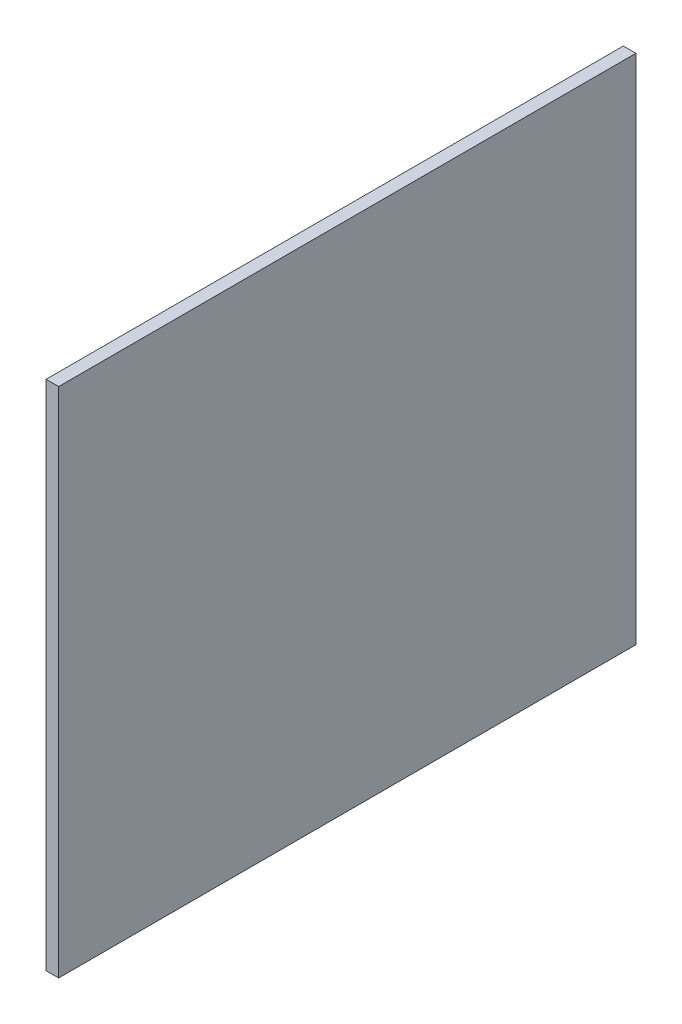
ISO-10303-21;
HEADER;
FILE_DESCRIPTION(('STEP AP214'),'2;1');
FILE_NAME('part.step','',(''),(''),'','','');
FILE_SCHEMA(('AUTOMOTIVE_DESIGN { 1 0 10303 214 1 1 1 1 }'));
ENDSEC;
DATA;
#1=APPLICATION_CONTEXT('core data for automotive mechanical design processes');
#2=APPLICATION_PROTOCOL_DEFINITION('international standard','automotive_design',2000,#1);
#3=PRODUCT_CONTEXT('',#1,'mechanical');
#4=PRODUCT('Part','Part','',(#3));
#5=PRODUCT_RELATED_PRODUCT_CATEGORY('part','',(#4));
#6=PRODUCT_DEFINITION_FORMATION('','',#4);
#7=PRODUCT_DEFINITION_CONTEXT('part definition',#1,'design');
#8=PRODUCT_DEFINITION('design','',#6,#7);
#9=PRODUCT_DEFINITION_SHAPE('','',#8);
#10=(LENGTH_UNIT() NAMED_UNIT(*) SI_UNIT(.MILLI.,.METRE.));
#11=(NAMED_UNIT(*) PLANE_ANGLE_UNIT() SI_UNIT($,.RADIAN.));
#12=(NAMED_UNIT(*) SI_UNIT($,.STERADIAN.) SOLID_ANGLE_UNIT());
#13=UNCERTAINTY_MEASURE_WITH_UNIT(LENGTH_MEASURE(1.E-05),#10,'distance_accuracy_value','');
#14=(GEOMETRIC_REPRESENTATION_CONTEXT(3) GLOBAL_UNCERTAINTY_ASSIGNED_CONTEXT((#13)) GLOBAL_UNIT_ASSIGNED_CONTEXT((#10,
#11,#12)) REPRESENTATION_CONTEXT('',''));
#15=CARTESIAN_POINT('',(0.,0.,0.));
#16=DIRECTION('',(0.,0.,1.));
#17=DIRECTION('',(1.,0.,0.));
#18=AXIS2_PLACEMENT_3D('',#15,#16,#17);
#19=CARTESIAN_POINT('',(-90.4615384615385,111.692307692308,550.));
#20=DIRECTION('',(1.,0.,0.));
#21=DIRECTION('',(0.,1.,0.));
#22=AXIS2_PLACEMENT_3D('',#19,#20,#21);
#23=PLANE('',#22);
#24=DIRECTION('',(0.,-1.,0.));
#25=VECTOR('',#24,1.);
#26=CARTESIAN_POINT('',(-90.4615384615385,111.692307692308,0.));
#27=LINE('',#26,#25);
#28=CARTESIAN_POINT('',(-90.4615384615385,111.692307692308,0.));
#29=VERTEX_POINT('',#28);
#30=CARTESIAN_POINT('',(-90.4615384615384,-376.307692307692,0.));
#31=VERTEX_POINT('',#30);
#32=EDGE_CURVE('E107',#29,#31,#27,.T.);
#33=ORIENTED_EDGE('',*,*,#32,.T.);
#34=DIRECTION('',(0.,0.,-1.));
#35=VECTOR('',#34,1.);
#36=CARTESIAN_POINT('',(-90.4615384615384,-376.307692307692,550.));
#37=LINE('',#36,#35);
#38=CARTESIAN_POINT('',(-90.4615384615384,-376.307692307692,550.));
#39=VERTEX_POINT('',#38);
#40=EDGE_CURVE('E11',#39,#31,#37,.T.);
#41=ORIENTED_EDGE('',*,*,#40,.F.);
#42=DIRECTION('',(0.,-1.,0.));
#43=VECTOR('',#42,1.);
#44=CARTESIAN_POINT('',(-90.4615384615385,111.692307692308,550.));
#45=LINE('',#44,#43);
#46=CARTESIAN_POINT('',(-90.4615384615385,111.692307692308,550.));
#47=VERTEX_POINT('',#46);
#48=EDGE_CURVE('E91',#47,#39,#45,.T.);
#49=ORIENTED_EDGE('',*,*,#48,.F.);
#50=DIRECTION('',(0.,0.,-1.));
#51=VECTOR('',#50,1.);
#52=CARTESIAN_POINT('',(-90.4615384615385,111.692307692308,550.));
#53=LINE('',#52,#51);
#54=EDGE_CURVE('E103',#47,#29,#53,.T.);
#55=ORIENTED_EDGE('',*,*,#54,.T.);
#56=EDGE_LOOP('',(#33,#41,#49,#55));
#57=FACE_BOUND('',#56,.T.);
#58=ADVANCED_FACE('F39',(#57),#23,.F.);
#59=CARTESIAN_POINT('',(-90.4615384615384,-376.307692307692,550.));
#60=DIRECTION('',(0.,1.,0.));
#61=DIRECTION('',(0.,0.,1.));
#62=AXIS2_PLACEMENT_3D('',#59,#60,#61);
#63=PLANE('',#62);
#64=DIRECTION('',(1.,0.,0.));
#65=VECTOR('',#64,1.);
#66=CARTESIAN_POINT('',(-90.4615384615384,-376.307692307692,0.));
#67=LINE('',#66,#65);
#68=CARTESIAN_POINT('',(-78.4615384615384,-376.307692307692,0.));
#69=VERTEX_POINT('',#68);
#70=EDGE_CURVE('E96',#31,#69,#67,.T.);
#71=ORIENTED_EDGE('',*,*,#70,.T.);
#72=DIRECTION('',(0.,0.,-1.));
#73=VECTOR('',#72,1.);
#74=CARTESIAN_POINT('',(-78.4615384615384,-376.307692307692,550.));
#75=LINE('',#74,#73);
#76=CARTESIAN_POINT('',(-78.4615384615384,-376.307692307692,550.));
#77=VERTEX_POINT('',#76);
#78=EDGE_CURVE('E48',#77,#69,#75,.T.);
#79=ORIENTED_EDGE('',*,*,#78,.F.);
#80=DIRECTION('',(1.,0.,0.));
#81=VECTOR('',#80,1.);
#82=CARTESIAN_POINT('',(-90.4615384615384,-376.307692307692,550.));
#83=LINE('',#82,#81);
#84=EDGE_CURVE('E86',#39,#77,#83,.T.);
#85=ORIENTED_EDGE('',*,*,#84,.F.);
#86=ORIENTED_EDGE('',*,*,#40,.T.);
#87=EDGE_LOOP('',(#71,#79,#85,#86));
#88=FACE_BOUND('',#87,.T.);
#89=ADVANCED_FACE('F95',(#88),#63,.F.);
#90=CARTESIAN_POINT('',(-78.4615384615385,111.692307692308,550.));
#91=DIRECTION('',(-1.,0.,0.));
#92=DIRECTION('',(0.,-1.,0.));
#93=AXIS2_PLACEMENT_3D('',#90,#91,#92);
#94=PLANE('',#93);
#95=DIRECTION('',(0.,1.,0.));
#96=VECTOR('',#95,1.);
#97=CARTESIAN_POINT('',(-78.4615384615385,111.692307692308,0.));
#98=LINE('',#97,#96);
#99=CARTESIAN_POINT('',(-78.4615384615385,111.692307692308,0.));
#100=VERTEX_POINT('',#99);
#101=EDGE_CURVE('E73',#69,#100,#98,.T.);
#102=ORIENTED_EDGE('',*,*,#101,.T.);
#103=DIRECTION('',(0.,0.,-1.));
#104=VECTOR('',#103,1.);
#105=CARTESIAN_POINT('',(-78.4615384615385,111.692307692308,550.));
#106=LINE('',#105,#104);
#107=CARTESIAN_POINT('',(-78.4615384615385,111.692307692308,550.));
#108=VERTEX_POINT('',#107);
#109=EDGE_CURVE('E98',#108,#100,#106,.T.);
#110=ORIENTED_EDGE('',*,*,#109,.F.);
#111=DIRECTION('',(0.,1.,0.));
#112=VECTOR('',#111,1.);
#113=CARTESIAN_POINT('',(-78.4615384615385,111.692307692308,550.));
#114=LINE('',#113,#112);
#115=EDGE_CURVE('E89',#77,#108,#114,.T.);
#116=ORIENTED_EDGE('',*,*,#115,.F.);
#117=ORIENTED_EDGE('',*,*,#78,.T.);
#118=EDGE_LOOP('',(#102,#110,#116,#117));
#119=FACE_BOUND('',#118,.T.);
#120=ADVANCED_FACE('F99',(#119),#94,.F.);
#121=CARTESIAN_POINT('',(-90.4615384615385,111.692307692308,550.));
#122=DIRECTION('',(0.,-1.,0.));
#123=DIRECTION('',(0.,0.,-1.));
#124=AXIS2_PLACEMENT_3D('',#121,#122,#123);
#125=PLANE('',#124);
#126=DIRECTION('',(-1.,0.,0.));
#127=VECTOR('',#126,1.);
#128=CARTESIAN_POINT('',(-90.4615384615385,111.692307692308,0.));
#129=LINE('',#128,#127);
#130=EDGE_CURVE('E79',#100,#29,#129,.T.);
#131=ORIENTED_EDGE('',*,*,#130,.T.);
#132=ORIENTED_EDGE('',*,*,#54,.F.);
#133=DIRECTION('',(-1.,0.,0.));
#134=VECTOR('',#133,1.);
#135=CARTESIAN_POINT('',(-90.4615384615385,111.692307692308,550.));
#136=LINE('',#135,#134);
#137=EDGE_CURVE('E56',#108,#47,#136,.T.);
#138=ORIENTED_EDGE('',*,*,#137,.F.);
#139=ORIENTED_EDGE('',*,*,#109,.T.);
#140=EDGE_LOOP('',(#131,#132,#138,#139));
#141=FACE_BOUND('',#140,.T.);
#142=ADVANCED_FACE('F120',(#141),#125,.F.);
#143=CARTESIAN_POINT('',(0.,0.,550.));
#144=DIRECTION('',(0.,0.,1.));
#145=DIRECTION('',(1.,0.,0.));
#146=AXIS2_PLACEMENT_3D('',#143,#144,#145);
#147=PLANE('',#146);
#148=ORIENTED_EDGE('',*,*,#48,.T.);
#149=ORIENTED_EDGE('',*,*,#84,.T.);
#150=ORIENTED_EDGE('',*,*,#115,.T.);
#151=ORIENTED_EDGE('',*,*,#137,.T.);
#152=EDGE_LOOP('',(#148,#149,#150,#151));
#153=FACE_BOUND('',#152,.T.);
#154=ADVANCED_FACE('F87',(#153),#147,.T.);
#155=CARTESIAN_POINT('',(0.,0.,0.));
#156=DIRECTION('',(0.,0.,1.));
#157=DIRECTION('',(1.,0.,0.));
#158=AXIS2_PLACEMENT_3D('',#155,#156,#157);
#159=PLANE('',#158);
#160=ORIENTED_EDGE('',*,*,#32,.F.);
#161=ORIENTED_EDGE('',*,*,#130,.F.);
#162=ORIENTED_EDGE('',*,*,#101,.F.);
#163=ORIENTED_EDGE('',*,*,#70,.F.);
#164=EDGE_LOOP('',(#160,#161,#162,#163));
#165=FACE_BOUND('',#164,.T.);
#166=ADVANCED_FACE('F123',(#165),#159,.F.);
#167=CLOSED_SHELL('',(#58,#89,#120,#142,#154,#166));
#168=MANIFOLD_SOLID_BREP('B2',#167);
#169=ADVANCED_BREP_SHAPE_REPRESENTATION('',(#18,#168),#14);
#170=SHAPE_DEFINITION_REPRESENTATION(#9,#169);
ENDSEC;
END-ISO-10303-21;
